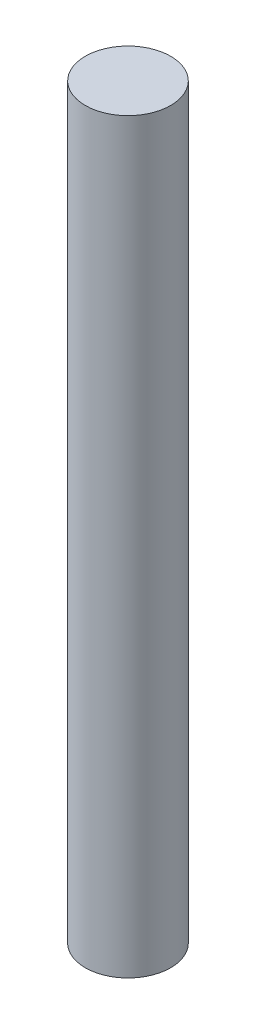
ISO-10303-21;
HEADER;
FILE_DESCRIPTION(('STEP AP214'),'2;1');
FILE_NAME('part.step','',(''),(''),'','','');
FILE_SCHEMA(('AUTOMOTIVE_DESIGN { 1 0 10303 214 1 1 1 1 }'));
ENDSEC;
DATA;
#1=APPLICATION_CONTEXT('core data for automotive mechanical design processes');
#2=APPLICATION_PROTOCOL_DEFINITION('international standard','automotive_design',2000,#1);
#3=PRODUCT_CONTEXT('',#1,'mechanical');
#4=PRODUCT('Part','Part','',(#3));
#5=PRODUCT_RELATED_PRODUCT_CATEGORY('part','',(#4));
#6=PRODUCT_DEFINITION_FORMATION('','',#4);
#7=PRODUCT_DEFINITION_CONTEXT('part definition',#1,'design');
#8=PRODUCT_DEFINITION('design','',#6,#7);
#9=PRODUCT_DEFINITION_SHAPE('','',#8);
#10=(LENGTH_UNIT() NAMED_UNIT(*) SI_UNIT(.MILLI.,.METRE.));
#11=(NAMED_UNIT(*) PLANE_ANGLE_UNIT() SI_UNIT($,.RADIAN.));
#12=(NAMED_UNIT(*) SI_UNIT($,.STERADIAN.) SOLID_ANGLE_UNIT());
#13=UNCERTAINTY_MEASURE_WITH_UNIT(LENGTH_MEASURE(1.E-05),#10,'distance_accuracy_value','');
#14=(GEOMETRIC_REPRESENTATION_CONTEXT(3) GLOBAL_UNCERTAINTY_ASSIGNED_CONTEXT((#13)) GLOBAL_UNIT_ASSIGNED_CONTEXT((#10,
#11,#12)) REPRESENTATION_CONTEXT('',''));
#15=CARTESIAN_POINT('',(0.,0.,0.));
#16=DIRECTION('',(0.,0.,1.));
#17=DIRECTION('',(1.,0.,0.));
#18=AXIS2_PLACEMENT_3D('',#15,#16,#17);
#19=CARTESIAN_POINT('',(0.,35.,0.));
#20=DIRECTION('',(0.,-1.,0.));
#21=DIRECTION('',(0.,0.,-1.));
#22=AXIS2_PLACEMENT_3D('',#19,#20,#21);
#23=CYLINDRICAL_SURFACE('',#22,4.);
#24=CARTESIAN_POINT('',(0.,35.,0.));
#25=DIRECTION('',(0.,1.,0.));
#26=DIRECTION('',(0.,0.,1.));
#27=AXIS2_PLACEMENT_3D('',#24,#25,#26);
#28=CIRCLE('',#27,4.);
#29=CARTESIAN_POINT('',(0.,35.,4.));
#30=VERTEX_POINT('',#29);
#31=EDGE_CURVE('E10',#30,#30,#28,.T.);
#32=ORIENTED_EDGE('',*,*,#31,.F.);
#33=EDGE_LOOP('',(#32));
#34=FACE_BOUND('',#33,.T.);
#35=CARTESIAN_POINT('',(0.,-35.,0.));
#36=DIRECTION('',(0.,1.,0.));
#37=DIRECTION('',(0.,0.,1.));
#38=AXIS2_PLACEMENT_3D('',#35,#36,#37);
#39=CIRCLE('',#38,4.);
#40=CARTESIAN_POINT('',(0.,-35.,4.));
#41=VERTEX_POINT('',#40);
#42=EDGE_CURVE('E33',#41,#41,#39,.T.);
#43=ORIENTED_EDGE('',*,*,#42,.T.);
#44=EDGE_LOOP('',(#43));
#45=FACE_BOUND('',#44,.T.);
#46=ADVANCED_FACE('F30',(#34,#45),#23,.T.);
#47=CARTESIAN_POINT('',(0.,35.,0.));
#48=DIRECTION('',(0.,1.,0.));
#49=DIRECTION('',(0.,0.,1.));
#50=AXIS2_PLACEMENT_3D('',#47,#48,#49);
#51=PLANE('',#50);
#52=ORIENTED_EDGE('',*,*,#31,.T.);
#53=EDGE_LOOP('',(#52));
#54=FACE_BOUND('',#53,.T.);
#55=ADVANCED_FACE('F45',(#54),#51,.T.);
#56=CARTESIAN_POINT('',(0.,-35.,0.));
#57=DIRECTION('',(0.,1.,0.));
#58=DIRECTION('',(0.,0.,1.));
#59=AXIS2_PLACEMENT_3D('',#56,#57,#58);
#60=PLANE('',#59);
#61=ORIENTED_EDGE('',*,*,#42,.F.);
#62=EDGE_LOOP('',(#61));
#63=FACE_BOUND('',#62,.T.);
#64=ADVANCED_FACE('F43',(#63),#60,.F.);
#65=CLOSED_SHELL('',(#46,#55,#64));
#66=MANIFOLD_SOLID_BREP('B2',#65);
#67=ADVANCED_BREP_SHAPE_REPRESENTATION('',(#18,#66),#14);
#68=SHAPE_DEFINITION_REPRESENTATION(#9,#67);
ENDSEC;
END-ISO-10303-21;
